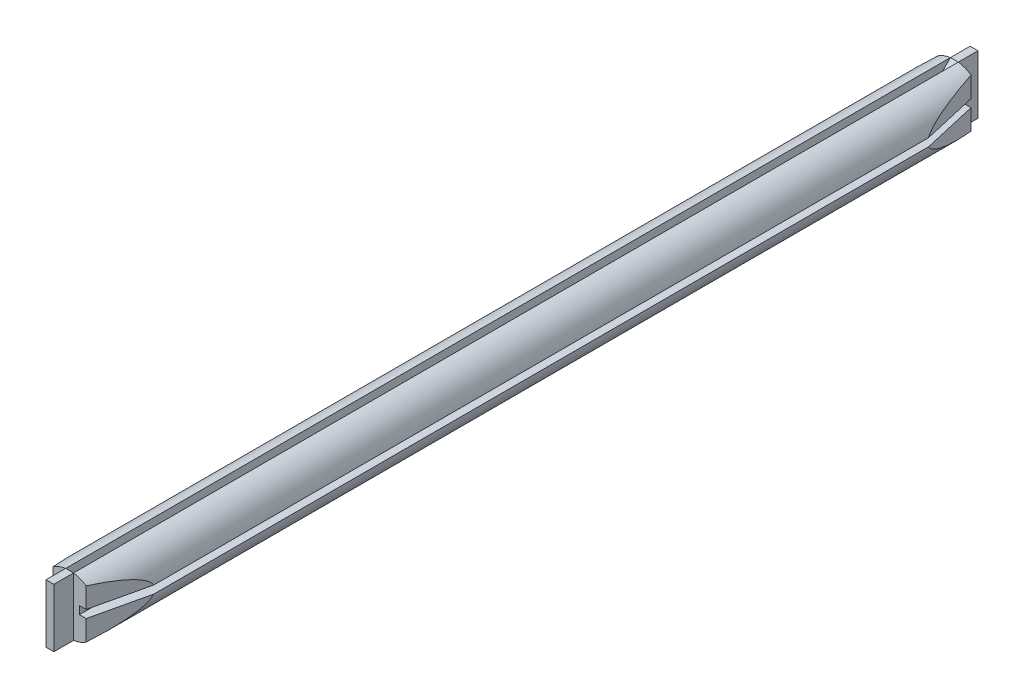
ISO-10303-21;
HEADER;
FILE_DESCRIPTION(('STEP AP214'),'2;1');
FILE_NAME('part.step','',(''),(''),'','','');
FILE_SCHEMA(('AUTOMOTIVE_DESIGN { 1 0 10303 214 1 1 1 1 }'));
ENDSEC;
DATA;
#1=APPLICATION_CONTEXT('core data for automotive mechanical design processes');
#2=APPLICATION_PROTOCOL_DEFINITION('international standard','automotive_design',2000,#1);
#3=PRODUCT_CONTEXT('',#1,'mechanical');
#4=PRODUCT('Part','Part','',(#3));
#5=PRODUCT_RELATED_PRODUCT_CATEGORY('part','',(#4));
#6=PRODUCT_DEFINITION_FORMATION('','',#4);
#7=PRODUCT_DEFINITION_CONTEXT('part definition',#1,'design');
#8=PRODUCT_DEFINITION('design','',#6,#7);
#9=PRODUCT_DEFINITION_SHAPE('','',#8);
#10=(LENGTH_UNIT() NAMED_UNIT(*) SI_UNIT(.MILLI.,.METRE.));
#11=(NAMED_UNIT(*) PLANE_ANGLE_UNIT() SI_UNIT($,.RADIAN.));
#12=(NAMED_UNIT(*) SI_UNIT($,.STERADIAN.) SOLID_ANGLE_UNIT());
#13=UNCERTAINTY_MEASURE_WITH_UNIT(LENGTH_MEASURE(1.E-05),#10,'distance_accuracy_value','');
#14=(GEOMETRIC_REPRESENTATION_CONTEXT(3) GLOBAL_UNCERTAINTY_ASSIGNED_CONTEXT((#13)) GLOBAL_UNIT_ASSIGNED_CONTEXT((#10,
#11,#12)) REPRESENTATION_CONTEXT('',''));
#15=CARTESIAN_POINT('',(0.,0.,0.));
#16=DIRECTION('',(0.,0.,1.));
#17=DIRECTION('',(1.,0.,0.));
#18=AXIS2_PLACEMENT_3D('',#15,#16,#17);
#19=CARTESIAN_POINT('',(0.,0.,2250.));
#20=DIRECTION('',(0.,0.,-1.));
#21=DIRECTION('',(1.,0.,0.));
#22=AXIS2_PLACEMENT_3D('',#19,#20,#21);
#23=PLANE('',#22);
#24=DIRECTION('',(0.,-1.,0.));
#25=VECTOR('',#24,1.);
#26=CARTESIAN_POINT('',(-6.65464811282355,0.,2250.));
#27=LINE('',#26,#25);
#28=CARTESIAN_POINT('',(-6.65464811282354,55.7901455600984,2250.));
#29=VERTEX_POINT('',#28);
#30=CARTESIAN_POINT('',(-6.65464811282356,-92.8705419130867,2250.));
#31=VERTEX_POINT('',#30);
#32=EDGE_CURVE('E238',#29,#31,#27,.T.);
#33=ORIENTED_EDGE('',*,*,#32,.F.);
#34=CARTESIAN_POINT('',(3.34535188717645,-18.5401981764941,2250.));
#35=DIRECTION('',(0.,0.,1.));
#36=DIRECTION('',(1.,0.,0.));
#37=AXIS2_PLACEMENT_3D('',#34,#35,#36);
#38=CIRCLE('',#37,75.);
#39=CARTESIAN_POINT('',(-38.8198199811198,43.4847829304521,2250.));
#40=VERTEX_POINT('',#39);
#41=EDGE_CURVE('E312',#29,#40,#38,.T.);
#42=ORIENTED_EDGE('',*,*,#41,.T.);
#43=DIRECTION('',(0.,1.,0.));
#44=VECTOR('',#43,1.);
#45=CARTESIAN_POINT('',(-38.8198199811198,0.,2250.));
#46=LINE('',#45,#44);
#47=CARTESIAN_POINT('',(-38.8198199811198,-8.54019817649414,2250.));
#48=VERTEX_POINT('',#47);
#49=EDGE_CURVE('E464',#48,#40,#46,.T.);
#50=ORIENTED_EDGE('',*,*,#49,.F.);
#51=DIRECTION('',(1.,0.,0.));
#52=VECTOR('',#51,1.);
#53=CARTESIAN_POINT('',(0.,-8.54019817649415,2250.));
#54=LINE('',#53,#52);
#55=CARTESIAN_POINT('',(-21.6546481128235,-8.54019817649414,2250.));
#56=VERTEX_POINT('',#55);
#57=EDGE_CURVE('E310',#48,#56,#54,.T.);
#58=ORIENTED_EDGE('',*,*,#57,.T.);
#59=DIRECTION('',(0.,1.,0.));
#60=VECTOR('',#59,1.);
#61=CARTESIAN_POINT('',(-21.6546481128235,0.,2250.));
#62=LINE('',#61,#60);
#63=CARTESIAN_POINT('',(-21.6546481128235,-28.5401981764941,2250.));
#64=VERTEX_POINT('',#63);
#65=EDGE_CURVE('E307',#64,#56,#62,.T.);
#66=ORIENTED_EDGE('',*,*,#65,.F.);
#67=DIRECTION('',(1.,0.,0.));
#68=VECTOR('',#67,1.);
#69=CARTESIAN_POINT('',(0.,-28.5401981764941,2250.));
#70=LINE('',#69,#68);
#71=CARTESIAN_POINT('',(-38.8198199811198,-28.5401981764941,2250.));
#72=VERTEX_POINT('',#71);
#73=EDGE_CURVE('E305',#72,#64,#70,.T.);
#74=ORIENTED_EDGE('',*,*,#73,.F.);
#75=CARTESIAN_POINT('',(-38.8198199811198,-80.5651792834404,2250.));
#76=VERTEX_POINT('',#75);
#77=EDGE_CURVE('E465',#76,#72,#46,.T.);
#78=ORIENTED_EDGE('',*,*,#77,.F.);
#79=CARTESIAN_POINT('',(3.34535188717645,-18.5401981764941,2250.));
#80=DIRECTION('',(0.,0.,1.));
#81=DIRECTION('',(1.,0.,0.));
#82=AXIS2_PLACEMENT_3D('',#79,#80,#81);
#83=CIRCLE('',#82,75.);
#84=EDGE_CURVE('E302',#76,#31,#83,.T.);
#85=ORIENTED_EDGE('',*,*,#84,.T.);
#86=EDGE_LOOP('',(#33,#42,#50,#58,#66,#74,#78,#85));
#87=FACE_BOUND('',#86,.T.);
#88=ADVANCED_FACE('F35',(#87),#23,.F.);
#89=CARTESIAN_POINT('',(0.,-8.54019817649414,1125.));
#90=DIRECTION('',(0.,-1.,0.));
#91=DIRECTION('',(0.,0.,-1.));
#92=AXIS2_PLACEMENT_3D('',#89,#90,#91);
#93=PLANE('',#92);
#94=DIRECTION('',(0.,0.,-1.));
#95=VECTOR('',#94,1.);
#96=CARTESIAN_POINT('',(77.675695623769,-8.54019817649414,1125.));
#97=LINE('',#96,#95);
#98=CARTESIAN_POINT('',(77.675695623769,-8.54019817649367,2110.));
#99=VERTEX_POINT('',#98);
#100=CARTESIAN_POINT('',(77.675695623769,-8.54019817649421,140.));
#101=VERTEX_POINT('',#100);
#102=EDGE_CURVE('E454',#99,#101,#97,.T.);
#103=ORIENTED_EDGE('',*,*,#102,.F.);
#104=DIRECTION('',(-0.223917412590911,0.,0.974608122446449));
#105=VECTOR('',#104,1.);
#106=CARTESIAN_POINT('',(288.739366458054,-8.54019817649414,1191.33822390904));
#107=LINE('',#106,#105);
#108=CARTESIAN_POINT('',(45.5105237554727,-8.54019817649414,2250.));
#109=VERTEX_POINT('',#108);
#110=EDGE_CURVE('E289',#99,#109,#107,.T.);
#111=ORIENTED_EDGE('',*,*,#110,.T.);
#112=DIRECTION('',(-1.,0.,0.));
#113=VECTOR('',#112,1.);
#114=CARTESIAN_POINT('',(0.,-8.54019817649414,2250.));
#115=LINE('',#114,#113);
#116=CARTESIAN_POINT('',(28.3453518871764,-8.54019817649414,2250.));
#117=VERTEX_POINT('',#116);
#118=EDGE_CURVE('E292',#109,#117,#115,.T.);
#119=ORIENTED_EDGE('',*,*,#118,.T.);
#120=DIRECTION('',(0.,0.,-1.));
#121=VECTOR('',#120,1.);
#122=CARTESIAN_POINT('',(28.3453518871764,-8.54019817649414,1125.));
#123=LINE('',#122,#121);
#124=CARTESIAN_POINT('',(28.3453518871764,-8.54019817649414,0.));
#125=VERTEX_POINT('',#124);
#126=EDGE_CURVE('E416',#117,#125,#123,.T.);
#127=ORIENTED_EDGE('',*,*,#126,.T.);
#128=DIRECTION('',(-1.,0.,0.));
#129=VECTOR('',#128,1.);
#130=CARTESIAN_POINT('',(0.,-8.54019817649414,0.));
#131=LINE('',#130,#129);
#132=CARTESIAN_POINT('',(45.5105237554727,-8.54019817649414,0.));
#133=VERTEX_POINT('',#132);
#134=EDGE_CURVE('E390',#133,#125,#131,.T.);
#135=ORIENTED_EDGE('',*,*,#134,.F.);
#136=DIRECTION('',(-0.223917412590911,0.,-0.974608122446449));
#137=VECTOR('',#136,1.);
#138=CARTESIAN_POINT('',(288.739366458054,-8.54019817649414,1058.66177609096));
#139=LINE('',#138,#137);
#140=EDGE_CURVE('E388',#101,#133,#139,.T.);
#141=ORIENTED_EDGE('',*,*,#140,.F.);
#142=EDGE_LOOP('',(#103,#111,#119,#127,#135,#141));
#143=FACE_BOUND('',#142,.T.);
#144=ADVANCED_FACE('F37',(#143),#93,.T.);
#145=CARTESIAN_POINT('',(3.34535188717645,-18.5401981764941,1125.));
#146=DIRECTION('',(0.,0.,-1.));
#147=DIRECTION('',(-1.,0.,0.));
#148=AXIS2_PLACEMENT_3D('',#145,#146,#147);
#149=CYLINDRICAL_SURFACE('',#148,75.);
#150=CARTESIAN_POINT('',(3.34535188717645,-18.5401981764941,2433.52533870276));
#151=DIRECTION('',(0.974608122446449,0.,0.223917412590911));
#152=DIRECTION('',(0.223917412590911,0.,-0.974608122446449));
#153=AXIS2_PLACEMENT_3D('',#150,#151,#152);
#154=ELLIPSE('',#153,334.944920683869,75.);
#155=CARTESIAN_POINT('',(45.5105237554727,43.4847829304521,2250.));
#156=VERTEX_POINT('',#155);
#157=EDGE_CURVE('E287',#99,#156,#154,.T.);
#158=ORIENTED_EDGE('',*,*,#157,.F.);
#159=ORIENTED_EDGE('',*,*,#102,.T.);
#160=CARTESIAN_POINT('',(3.34535188717645,-18.5401981764941,-183.525338702757));
#161=DIRECTION('',(-0.974608122446449,0.,0.223917412590911));
#162=DIRECTION('',(-0.223917412590911,0.,-0.974608122446449));
#163=AXIS2_PLACEMENT_3D('',#160,#161,#162);
#164=ELLIPSE('',#163,334.944920683869,75.);
#165=CARTESIAN_POINT('',(45.5105237554727,43.4847829304521,0.));
#166=VERTEX_POINT('',#165);
#167=EDGE_CURVE('E385',#101,#166,#164,.T.);
#168=ORIENTED_EDGE('',*,*,#167,.T.);
#169=CARTESIAN_POINT('',(3.34535188717645,-18.5401981764941,0.));
#170=DIRECTION('',(0.,0.,1.));
#171=DIRECTION('',(1.,0.,0.));
#172=AXIS2_PLACEMENT_3D('',#169,#170,#171);
#173=CIRCLE('',#172,75.);
#174=CARTESIAN_POINT('',(13.3453518871765,55.7901455600984,0.));
#175=VERTEX_POINT('',#174);
#176=EDGE_CURVE('E392',#166,#175,#173,.T.);
#177=ORIENTED_EDGE('',*,*,#176,.T.);
#178=DIRECTION('',(0.,0.,-1.));
#179=VECTOR('',#178,1.);
#180=CARTESIAN_POINT('',(13.3453518871765,55.7901455600984,1125.));
#181=LINE('',#180,#179);
#182=CARTESIAN_POINT('',(13.3453518871764,55.7901455600984,2250.));
#183=VERTEX_POINT('',#182);
#184=EDGE_CURVE('E451',#183,#175,#181,.T.);
#185=ORIENTED_EDGE('',*,*,#184,.F.);
#186=CARTESIAN_POINT('',(3.34535188717645,-18.5401981764941,2250.));
#187=DIRECTION('',(0.,0.,1.));
#188=DIRECTION('',(1.,0.,0.));
#189=AXIS2_PLACEMENT_3D('',#186,#187,#188);
#190=CIRCLE('',#189,75.);
#191=EDGE_CURVE('E315',#156,#183,#190,.T.);
#192=ORIENTED_EDGE('',*,*,#191,.F.);
#193=EDGE_LOOP('',(#158,#159,#168,#177,#185,#192));
#194=FACE_BOUND('',#193,.T.);
#195=ADVANCED_FACE('F525',(#194),#149,.T.);
#196=CARTESIAN_POINT('',(3.34535188717645,-18.5401981764941,1125.));
#197=DIRECTION('',(0.,0.,-1.));
#198=DIRECTION('',(-1.,0.,0.));
#199=AXIS2_PLACEMENT_3D('',#196,#197,#198);
#200=CYLINDRICAL_SURFACE('',#199,75.);
#201=CARTESIAN_POINT('',(3.34535188717645,-18.5401981764941,2433.52533870276));
#202=DIRECTION('',(-0.974608122446449,0.,0.223917412590911));
#203=DIRECTION('',(-0.223917412590911,0.,-0.974608122446449));
#204=AXIS2_PLACEMENT_3D('',#201,#202,#203);
#205=ELLIPSE('',#204,334.944920683869,75.);
#206=CARTESIAN_POINT('',(-70.9849918494161,-8.54019817649414,2110.));
#207=VERTEX_POINT('',#206);
#208=EDGE_CURVE('E281',#40,#207,#205,.T.);
#209=ORIENTED_EDGE('',*,*,#208,.F.);
#210=ORIENTED_EDGE('',*,*,#41,.F.);
#211=DIRECTION('',(0.,0.,-1.));
#212=VECTOR('',#211,1.);
#213=CARTESIAN_POINT('',(-6.65464811282354,55.7901455600984,1125.));
#214=LINE('',#213,#212);
#215=CARTESIAN_POINT('',(-6.65464811282354,55.7901455600984,0.));
#216=VERTEX_POINT('',#215);
#217=EDGE_CURVE('E444',#29,#216,#214,.T.);
#218=ORIENTED_EDGE('',*,*,#217,.T.);
#219=CARTESIAN_POINT('',(3.34535188717645,-18.5401981764941,0.));
#220=DIRECTION('',(0.,0.,1.));
#221=DIRECTION('',(1.,0.,0.));
#222=AXIS2_PLACEMENT_3D('',#219,#220,#221);
#223=CIRCLE('',#222,75.);
#224=CARTESIAN_POINT('',(-38.8198199811198,43.4847829304521,0.));
#225=VERTEX_POINT('',#224);
#226=EDGE_CURVE('E395',#216,#225,#223,.T.);
#227=ORIENTED_EDGE('',*,*,#226,.T.);
#228=CARTESIAN_POINT('',(3.34535188717645,-18.5401981764941,-183.525338702757));
#229=DIRECTION('',(0.974608122446449,0.,0.223917412590911));
#230=DIRECTION('',(0.223917412590911,0.,-0.974608122446449));
#231=AXIS2_PLACEMENT_3D('',#228,#229,#230);
#232=ELLIPSE('',#231,334.944920683869,75.);
#233=CARTESIAN_POINT('',(-70.9849918494161,-8.54019817649414,140.));
#234=VERTEX_POINT('',#233);
#235=EDGE_CURVE('E376',#225,#234,#232,.T.);
#236=ORIENTED_EDGE('',*,*,#235,.T.);
#237=DIRECTION('',(0.,0.,-1.));
#238=VECTOR('',#237,1.);
#239=CARTESIAN_POINT('',(-70.9849918494161,-8.54019817649414,1125.));
#240=LINE('',#239,#238);
#241=EDGE_CURVE('E442',#207,#234,#240,.T.);
#242=ORIENTED_EDGE('',*,*,#241,.F.);
#243=EDGE_LOOP('',(#209,#210,#218,#227,#236,#242));
#244=FACE_BOUND('',#243,.T.);
#245=ADVANCED_FACE('F505',(#244),#200,.T.);
#246=CARTESIAN_POINT('',(0.,-8.54019817649415,1125.));
#247=DIRECTION('',(0.,1.,0.));
#248=DIRECTION('',(-1.,0.,0.));
#249=AXIS2_PLACEMENT_3D('',#246,#247,#248);
#250=PLANE('',#249);
#251=DIRECTION('',(0.223917412590911,0.,0.974608122446449));
#252=VECTOR('',#251,1.);
#253=CARTESIAN_POINT('',(-282.384127931503,-8.54019817649412,1189.87810005568));
#254=LINE('',#253,#252);
#255=EDGE_CURVE('E279',#207,#48,#254,.T.);
#256=ORIENTED_EDGE('',*,*,#255,.F.);
#257=ORIENTED_EDGE('',*,*,#241,.T.);
#258=DIRECTION('',(0.223917412590911,0.,-0.974608122446449));
#259=VECTOR('',#258,1.);
#260=CARTESIAN_POINT('',(-282.384127931503,-8.54019817649412,1060.12189994432));
#261=LINE('',#260,#259);
#262=CARTESIAN_POINT('',(-38.8198199811198,-8.54019817649414,0.));
#263=VERTEX_POINT('',#262);
#264=EDGE_CURVE('E373',#234,#263,#261,.T.);
#265=ORIENTED_EDGE('',*,*,#264,.T.);
#266=DIRECTION('',(1.,0.,0.));
#267=VECTOR('',#266,1.);
#268=CARTESIAN_POINT('',(0.,-8.54019817649415,0.));
#269=LINE('',#268,#267);
#270=CARTESIAN_POINT('',(-21.6546481128235,-8.54019817649414,0.));
#271=VERTEX_POINT('',#270);
#272=EDGE_CURVE('E398',#263,#271,#269,.T.);
#273=ORIENTED_EDGE('',*,*,#272,.T.);
#274=DIRECTION('',(0.,0.,-1.));
#275=VECTOR('',#274,1.);
#276=CARTESIAN_POINT('',(-21.6546481128235,-8.54019817649414,1125.));
#277=LINE('',#276,#275);
#278=EDGE_CURVE('E439',#56,#271,#277,.T.);
#279=ORIENTED_EDGE('',*,*,#278,.F.);
#280=ORIENTED_EDGE('',*,*,#57,.F.);
#281=EDGE_LOOP('',(#256,#257,#265,#273,#279,#280));
#282=FACE_BOUND('',#281,.T.);
#283=ADVANCED_FACE('F605',(#282),#250,.F.);
#284=CARTESIAN_POINT('',(0.,-28.5401981764941,1125.));
#285=DIRECTION('',(0.,1.,0.));
#286=DIRECTION('',(-1.,0.,0.));
#287=AXIS2_PLACEMENT_3D('',#284,#285,#286);
#288=PLANE('',#287);
#289=DIRECTION('',(0.,0.,-1.));
#290=VECTOR('',#289,1.);
#291=CARTESIAN_POINT('',(-70.9849918494161,-28.5401981764941,1125.));
#292=LINE('',#291,#290);
#293=CARTESIAN_POINT('',(-70.9849918494161,-28.5401981764947,2110.));
#294=VERTEX_POINT('',#293);
#295=CARTESIAN_POINT('',(-70.9849918494161,-28.5401981764941,140.));
#296=VERTEX_POINT('',#295);
#297=EDGE_CURVE('E434',#294,#296,#292,.T.);
#298=ORIENTED_EDGE('',*,*,#297,.F.);
#299=DIRECTION('',(0.223917412590911,0.,0.974608122446449));
#300=VECTOR('',#299,1.);
#301=CARTESIAN_POINT('',(-282.384127931503,-28.5401981764942,1189.87810005568));
#302=LINE('',#301,#300);
#303=EDGE_CURVE('E276',#294,#72,#302,.T.);
#304=ORIENTED_EDGE('',*,*,#303,.T.);
#305=ORIENTED_EDGE('',*,*,#73,.T.);
#306=DIRECTION('',(0.,0.,-1.));
#307=VECTOR('',#306,1.);
#308=CARTESIAN_POINT('',(-21.6546481128235,-28.5401981764941,1125.));
#309=LINE('',#308,#307);
#310=CARTESIAN_POINT('',(-21.6546481128235,-28.5401981764941,0.));
#311=VERTEX_POINT('',#310);
#312=EDGE_CURVE('E436',#64,#311,#309,.T.);
#313=ORIENTED_EDGE('',*,*,#312,.T.);
#314=DIRECTION('',(1.,0.,0.));
#315=VECTOR('',#314,1.);
#316=CARTESIAN_POINT('',(0.,-28.5401981764941,0.));
#317=LINE('',#316,#315);
#318=CARTESIAN_POINT('',(-38.8198199811198,-28.5401981764941,0.));
#319=VERTEX_POINT('',#318);
#320=EDGE_CURVE('E403',#319,#311,#317,.T.);
#321=ORIENTED_EDGE('',*,*,#320,.F.);
#322=DIRECTION('',(0.223917412590911,0.,-0.974608122446449));
#323=VECTOR('',#322,1.);
#324=CARTESIAN_POINT('',(-282.384127931503,-28.5401981764942,1060.12189994432));
#325=LINE('',#324,#323);
#326=EDGE_CURVE('E371',#296,#319,#325,.T.);
#327=ORIENTED_EDGE('',*,*,#326,.F.);
#328=EDGE_LOOP('',(#298,#304,#305,#313,#321,#327));
#329=FACE_BOUND('',#328,.T.);
#330=ADVANCED_FACE('F479',(#329),#288,.T.);
#331=CARTESIAN_POINT('',(3.34535188717645,-18.5401981764941,1125.));
#332=DIRECTION('',(0.,0.,-1.));
#333=DIRECTION('',(-1.,0.,0.));
#334=AXIS2_PLACEMENT_3D('',#331,#332,#333);
#335=CYLINDRICAL_SURFACE('',#334,75.);
#336=CARTESIAN_POINT('',(3.34535188717645,-18.5401981764941,2433.52533870276));
#337=DIRECTION('',(-0.974608122446449,0.,0.223917412590911));
#338=DIRECTION('',(-0.223917412590911,0.,-0.974608122446449));
#339=AXIS2_PLACEMENT_3D('',#336,#337,#338);
#340=ELLIPSE('',#339,334.944920683869,75.);
#341=EDGE_CURVE('E274',#294,#76,#340,.T.);
#342=ORIENTED_EDGE('',*,*,#341,.F.);
#343=ORIENTED_EDGE('',*,*,#297,.T.);
#344=CARTESIAN_POINT('',(3.34535188717645,-18.5401981764941,-183.525338702757));
#345=DIRECTION('',(0.974608122446449,0.,0.223917412590911));
#346=DIRECTION('',(0.223917412590911,0.,-0.974608122446449));
#347=AXIS2_PLACEMENT_3D('',#344,#345,#346);
#348=ELLIPSE('',#347,334.944920683869,75.);
#349=CARTESIAN_POINT('',(-38.8198199811198,-80.5651792834404,0.));
#350=VERTEX_POINT('',#349);
#351=EDGE_CURVE('E368',#296,#350,#348,.T.);
#352=ORIENTED_EDGE('',*,*,#351,.T.);
#353=CARTESIAN_POINT('',(3.34535188717645,-18.5401981764941,0.));
#354=DIRECTION('',(0.,0.,1.));
#355=DIRECTION('',(1.,0.,0.));
#356=AXIS2_PLACEMENT_3D('',#353,#354,#355);
#357=CIRCLE('',#356,75.);
#358=CARTESIAN_POINT('',(-6.65464811282357,-92.8705419130867,0.));
#359=VERTEX_POINT('',#358);
#360=EDGE_CURVE('E405',#350,#359,#357,.T.);
#361=ORIENTED_EDGE('',*,*,#360,.T.);
#362=DIRECTION('',(0.,0.,-1.));
#363=VECTOR('',#362,1.);
#364=CARTESIAN_POINT('',(-6.65464811282355,-92.8705419130867,1125.));
#365=LINE('',#364,#363);
#366=EDGE_CURVE('E431',#31,#359,#365,.T.);
#367=ORIENTED_EDGE('',*,*,#366,.F.);
#368=ORIENTED_EDGE('',*,*,#84,.F.);
#369=EDGE_LOOP('',(#342,#343,#352,#361,#367,#368));
#370=FACE_BOUND('',#369,.T.);
#371=ADVANCED_FACE('F500',(#370),#335,.T.);
#372=CARTESIAN_POINT('',(3.34535188717645,-18.5401981764941,1125.));
#373=DIRECTION('',(0.,0.,-1.));
#374=DIRECTION('',(-1.,0.,0.));
#375=AXIS2_PLACEMENT_3D('',#372,#373,#374);
#376=CYLINDRICAL_SURFACE('',#375,75.);
#377=CARTESIAN_POINT('',(3.34535188717645,-18.5401981764941,2433.52533870276));
#378=DIRECTION('',(0.974608122446449,0.,0.223917412590911));
#379=DIRECTION('',(0.223917412590911,0.,-0.974608122446449));
#380=AXIS2_PLACEMENT_3D('',#377,#378,#379);
#381=ELLIPSE('',#380,334.944920683869,75.);
#382=CARTESIAN_POINT('',(45.5105237554727,-80.5651792834404,2250.));
#383=VERTEX_POINT('',#382);
#384=CARTESIAN_POINT('',(77.675695623769,-28.5401981764941,2110.));
#385=VERTEX_POINT('',#384);
#386=EDGE_CURVE('E285',#383,#385,#381,.T.);
#387=ORIENTED_EDGE('',*,*,#386,.F.);
#388=CARTESIAN_POINT('',(3.34535188717645,-18.5401981764941,2250.));
#389=DIRECTION('',(0.,0.,1.));
#390=DIRECTION('',(1.,0.,0.));
#391=AXIS2_PLACEMENT_3D('',#388,#389,#390);
#392=CIRCLE('',#391,75.);
#393=CARTESIAN_POINT('',(13.3453518871765,-92.8705419130867,2250.));
#394=VERTEX_POINT('',#393);
#395=EDGE_CURVE('E299',#394,#383,#392,.T.);
#396=ORIENTED_EDGE('',*,*,#395,.F.);
#397=DIRECTION('',(0.,0.,-1.));
#398=VECTOR('',#397,1.);
#399=CARTESIAN_POINT('',(13.3453518871765,-92.8705419130867,1125.));
#400=LINE('',#399,#398);
#401=CARTESIAN_POINT('',(13.3453518871764,-92.8705419130867,0.));
#402=VERTEX_POINT('',#401);
#403=EDGE_CURVE('E424',#394,#402,#400,.T.);
#404=ORIENTED_EDGE('',*,*,#403,.T.);
#405=CARTESIAN_POINT('',(3.34535188717645,-18.5401981764941,0.));
#406=DIRECTION('',(0.,0.,1.));
#407=DIRECTION('',(1.,0.,0.));
#408=AXIS2_PLACEMENT_3D('',#405,#406,#407);
#409=CIRCLE('',#408,75.);
#410=CARTESIAN_POINT('',(45.5105237554727,-80.5651792834404,0.));
#411=VERTEX_POINT('',#410);
#412=EDGE_CURVE('E408',#402,#411,#409,.T.);
#413=ORIENTED_EDGE('',*,*,#412,.T.);
#414=CARTESIAN_POINT('',(3.34535188717645,-18.5401981764941,-183.525338702757));
#415=DIRECTION('',(-0.974608122446449,0.,0.223917412590911));
#416=DIRECTION('',(-0.223917412590911,0.,-0.974608122446449));
#417=AXIS2_PLACEMENT_3D('',#414,#415,#416);
#418=ELLIPSE('',#417,334.944920683869,75.);
#419=CARTESIAN_POINT('',(77.675695623769,-28.5401981764941,140.));
#420=VERTEX_POINT('',#419);
#421=EDGE_CURVE('E382',#411,#420,#418,.T.);
#422=ORIENTED_EDGE('',*,*,#421,.T.);
#423=DIRECTION('',(0.,0.,-1.));
#424=VECTOR('',#423,1.);
#425=CARTESIAN_POINT('',(77.675695623769,-28.5401981764941,1125.));
#426=LINE('',#425,#424);
#427=EDGE_CURVE('E422',#385,#420,#426,.T.);
#428=ORIENTED_EDGE('',*,*,#427,.F.);
#429=EDGE_LOOP('',(#387,#396,#404,#413,#422,#428));
#430=FACE_BOUND('',#429,.T.);
#431=ADVANCED_FACE('F578',(#430),#376,.T.);
#432=CARTESIAN_POINT('',(0.,-28.5401981764941,1125.));
#433=DIRECTION('',(0.,-1.,0.));
#434=DIRECTION('',(1.,0.,0.));
#435=AXIS2_PLACEMENT_3D('',#432,#433,#434);
#436=PLANE('',#435);
#437=DIRECTION('',(-0.223917412590911,0.,0.974608122446449));
#438=VECTOR('',#437,1.);
#439=CARTESIAN_POINT('',(288.739366458054,-28.5401981764942,1191.33822390904));
#440=LINE('',#439,#438);
#441=CARTESIAN_POINT('',(45.5105237554727,-28.5401981764941,2250.));
#442=VERTEX_POINT('',#441);
#443=EDGE_CURVE('E283',#385,#442,#440,.T.);
#444=ORIENTED_EDGE('',*,*,#443,.F.);
#445=ORIENTED_EDGE('',*,*,#427,.T.);
#446=DIRECTION('',(-0.223917412590911,0.,-0.974608122446449));
#447=VECTOR('',#446,1.);
#448=CARTESIAN_POINT('',(288.739366458054,-28.5401981764942,1058.66177609096));
#449=LINE('',#448,#447);
#450=CARTESIAN_POINT('',(45.5105237554727,-28.5401981764941,0.));
#451=VERTEX_POINT('',#450);
#452=EDGE_CURVE('E379',#420,#451,#449,.T.);
#453=ORIENTED_EDGE('',*,*,#452,.T.);
#454=DIRECTION('',(-1.,0.,0.));
#455=VECTOR('',#454,1.);
#456=CARTESIAN_POINT('',(0.,-28.5401981764941,0.));
#457=LINE('',#456,#455);
#458=CARTESIAN_POINT('',(28.3453518871764,-28.5401981764941,0.));
#459=VERTEX_POINT('',#458);
#460=EDGE_CURVE('E411',#451,#459,#457,.T.);
#461=ORIENTED_EDGE('',*,*,#460,.T.);
#462=DIRECTION('',(0.,0.,-1.));
#463=VECTOR('',#462,1.);
#464=CARTESIAN_POINT('',(28.3453518871764,-28.5401981764941,1125.));
#465=LINE('',#464,#463);
#466=CARTESIAN_POINT('',(28.3453518871764,-28.5401981764941,2250.));
#467=VERTEX_POINT('',#466);
#468=EDGE_CURVE('E419',#467,#459,#465,.T.);
#469=ORIENTED_EDGE('',*,*,#468,.F.);
#470=DIRECTION('',(-1.,0.,0.));
#471=VECTOR('',#470,1.);
#472=CARTESIAN_POINT('',(0.,-28.5401981764941,2250.));
#473=LINE('',#472,#471);
#474=EDGE_CURVE('E297',#442,#467,#473,.T.);
#475=ORIENTED_EDGE('',*,*,#474,.F.);
#476=EDGE_LOOP('',(#444,#445,#453,#461,#469,#475));
#477=FACE_BOUND('',#476,.T.);
#478=ADVANCED_FACE('F572',(#477),#436,.F.);
#479=ORIENTED_EDGE('',*,*,#191,.T.);
#480=DIRECTION('',(0.,-1.,0.));
#481=VECTOR('',#480,1.);
#482=CARTESIAN_POINT('',(13.3453518871765,0.,2250.));
#483=LINE('',#482,#481);
#484=EDGE_CURVE('E232',#183,#394,#483,.T.);
#485=ORIENTED_EDGE('',*,*,#484,.T.);
#486=ORIENTED_EDGE('',*,*,#395,.T.);
#487=DIRECTION('',(0.,-1.,0.));
#488=VECTOR('',#487,1.);
#489=CARTESIAN_POINT('',(45.5105237554727,0.,2250.));
#490=LINE('',#489,#488);
#491=EDGE_CURVE('E466',#442,#383,#490,.T.);
#492=ORIENTED_EDGE('',*,*,#491,.F.);
#493=ORIENTED_EDGE('',*,*,#474,.T.);
#494=DIRECTION('',(0.,-1.,0.));
#495=VECTOR('',#494,1.);
#496=CARTESIAN_POINT('',(28.3453518871764,0.,2250.));
#497=LINE('',#496,#495);
#498=EDGE_CURVE('E294',#117,#467,#497,.T.);
#499=ORIENTED_EDGE('',*,*,#498,.F.);
#500=ORIENTED_EDGE('',*,*,#118,.F.);
#501=EDGE_CURVE('E43',#156,#109,#490,.T.);
#502=ORIENTED_EDGE('',*,*,#501,.F.);
#503=EDGE_LOOP('',(#479,#485,#486,#492,#493,#499,#500,#502));
#504=FACE_BOUND('',#503,.T.);
#505=ADVANCED_FACE('F519',(#504),#23,.F.);
#506=CARTESIAN_POINT('',(0.,0.,0.));
#507=DIRECTION('',(0.,0.,1.));
#508=DIRECTION('',(1.,0.,0.));
#509=AXIS2_PLACEMENT_3D('',#506,#507,#508);
#510=PLANE('',#509);
#511=DIRECTION('',(0.,-1.,0.));
#512=VECTOR('',#511,1.);
#513=CARTESIAN_POINT('',(13.3453518871765,0.,0.));
#514=LINE('',#513,#512);
#515=EDGE_CURVE('E323',#175,#402,#514,.T.);
#516=ORIENTED_EDGE('',*,*,#515,.F.);
#517=ORIENTED_EDGE('',*,*,#176,.F.);
#518=DIRECTION('',(0.,-1.,0.));
#519=VECTOR('',#518,1.);
#520=CARTESIAN_POINT('',(45.5105237554727,0.,0.));
#521=LINE('',#520,#519);
#522=EDGE_CURVE('E463',#166,#133,#521,.T.);
#523=ORIENTED_EDGE('',*,*,#522,.T.);
#524=ORIENTED_EDGE('',*,*,#134,.T.);
#525=DIRECTION('',(0.,-1.,0.));
#526=VECTOR('',#525,1.);
#527=CARTESIAN_POINT('',(28.3453518871764,0.,0.));
#528=LINE('',#527,#526);
#529=EDGE_CURVE('E413',#125,#459,#528,.T.);
#530=ORIENTED_EDGE('',*,*,#529,.T.);
#531=ORIENTED_EDGE('',*,*,#460,.F.);
#532=EDGE_CURVE('E460',#451,#411,#521,.T.);
#533=ORIENTED_EDGE('',*,*,#532,.T.);
#534=ORIENTED_EDGE('',*,*,#412,.F.);
#535=EDGE_LOOP('',(#516,#517,#523,#524,#530,#531,#533,#534));
#536=FACE_BOUND('',#535,.T.);
#537=ADVANCED_FACE('F530',(#536),#510,.F.);
#538=CARTESIAN_POINT('',(13.3453518871765,0.,1125.));
#539=DIRECTION('',(1.,0.,0.));
#540=DIRECTION('',(0.,1.,0.));
#541=AXIS2_PLACEMENT_3D('',#538,#539,#540);
#542=PLANE('',#541);
#543=DIRECTION('',(0.,0.,-1.));
#544=VECTOR('',#543,1.);
#545=CARTESIAN_POINT('',(13.3453518871765,6.45980182350586,1125.));
#546=LINE('',#545,#544);
#547=CARTESIAN_POINT('',(13.3453518871765,6.45980182350586,2200.66965626341));
#548=VERTEX_POINT('',#547);
#549=CARTESIAN_POINT('',(13.3453518871765,6.45980182350586,49.3303437365926));
#550=VERTEX_POINT('',#549);
#551=EDGE_CURVE('E449',#548,#550,#546,.T.);
#552=ORIENTED_EDGE('',*,*,#551,.F.);
#553=DIRECTION('',(0.,-0.707106781186548,-0.707106781186548));
#554=VECTOR('',#553,1.);
#555=CARTESIAN_POINT('',(13.3453518871764,-18.5401981764941,2175.66965626341));
#556=LINE('',#555,#554);
#557=EDGE_CURVE('E262',#183,#548,#556,.T.);
#558=ORIENTED_EDGE('',*,*,#557,.F.);
#559=ORIENTED_EDGE('',*,*,#184,.T.);
#560=DIRECTION('',(0.,-0.707106781186547,0.707106781186548));
#561=VECTOR('',#560,1.);
#562=CARTESIAN_POINT('',(13.3453518871764,-18.5401981764941,74.3303437365925));
#563=LINE('',#562,#561);
#564=EDGE_CURVE('E356',#175,#550,#563,.T.);
#565=ORIENTED_EDGE('',*,*,#564,.T.);
#566=EDGE_LOOP('',(#552,#558,#559,#565));
#567=FACE_BOUND('',#566,.T.);
#568=ADVANCED_FACE('F513',(#567),#542,.F.);
#569=CARTESIAN_POINT('',(0.,6.45980182350586,1125.));
#570=DIRECTION('',(0.,1.,0.));
#571=DIRECTION('',(0.,0.,1.));
#572=AXIS2_PLACEMENT_3D('',#569,#570,#571);
#573=PLANE('',#572);
#574=DIRECTION('',(-1.,0.,0.));
#575=VECTOR('',#574,1.);
#576=CARTESIAN_POINT('',(-2.26958411043693E-13,6.45980182350586,2200.66965626341));
#577=LINE('',#576,#575);
#578=CARTESIAN_POINT('',(-6.65464811282355,6.45980182350589,2200.66965626341));
#579=VERTEX_POINT('',#578);
#580=EDGE_CURVE('E50',#548,#579,#577,.T.);
#581=ORIENTED_EDGE('',*,*,#580,.F.);
#582=ORIENTED_EDGE('',*,*,#551,.T.);
#583=DIRECTION('',(-1.,0.,0.));
#584=VECTOR('',#583,1.);
#585=CARTESIAN_POINT('',(-2.26958411043693E-13,6.45980182350586,49.3303437365926));
#586=LINE('',#585,#584);
#587=CARTESIAN_POINT('',(-6.65464811282355,6.45980182350583,49.3303437365926));
#588=VERTEX_POINT('',#587);
#589=EDGE_CURVE('E365',#550,#588,#586,.T.);
#590=ORIENTED_EDGE('',*,*,#589,.T.);
#591=DIRECTION('',(0.,0.,-1.));
#592=VECTOR('',#591,1.);
#593=CARTESIAN_POINT('',(-6.65464811282355,6.45980182350586,1125.));
#594=LINE('',#593,#592);
#595=EDGE_CURVE('E447',#579,#588,#594,.T.);
#596=ORIENTED_EDGE('',*,*,#595,.F.);
#597=EDGE_LOOP('',(#581,#582,#590,#596));
#598=FACE_BOUND('',#597,.T.);
#599=ADVANCED_FACE('F553',(#598),#573,.T.);
#600=CARTESIAN_POINT('',(-6.65464811282355,0.,1125.));
#601=DIRECTION('',(1.,0.,0.));
#602=DIRECTION('',(0.,1.,0.));
#603=AXIS2_PLACEMENT_3D('',#600,#601,#602);
#604=PLANE('',#603);
#605=DIRECTION('',(0.,-0.707106781186548,-0.707106781186548));
#606=VECTOR('',#605,1.);
#607=CARTESIAN_POINT('',(-6.65464811282355,-18.5401981764941,2175.66965626341));
#608=LINE('',#607,#606);
#609=EDGE_CURVE('E58',#29,#579,#608,.T.);
#610=ORIENTED_EDGE('',*,*,#609,.T.);
#611=ORIENTED_EDGE('',*,*,#595,.T.);
#612=DIRECTION('',(0.,-0.707106781186548,0.707106781186548));
#613=VECTOR('',#612,1.);
#614=CARTESIAN_POINT('',(-6.65464811282355,-18.5401981764941,74.3303437365925));
#615=LINE('',#614,#613);
#616=EDGE_CURVE('E349',#216,#588,#615,.T.);
#617=ORIENTED_EDGE('',*,*,#616,.F.);
#618=ORIENTED_EDGE('',*,*,#217,.F.);
#619=EDGE_LOOP('',(#610,#611,#617,#618));
#620=FACE_BOUND('',#619,.T.);
#621=ADVANCED_FACE('F507',(#620),#604,.T.);
#622=CARTESIAN_POINT('',(-6.65464811282353,0.,1125.));
#623=DIRECTION('',(-1.,0.,0.));
#624=DIRECTION('',(0.,-1.,0.));
#625=AXIS2_PLACEMENT_3D('',#622,#623,#624);
#626=PLANE('',#625);
#627=DIRECTION('',(0.,0.,-1.));
#628=VECTOR('',#627,1.);
#629=CARTESIAN_POINT('',(-6.65464811282354,-43.5401981764941,1125.));
#630=LINE('',#629,#628);
#631=CARTESIAN_POINT('',(-6.65464811282354,-43.5401981764941,2200.66965626341));
#632=VERTEX_POINT('',#631);
#633=CARTESIAN_POINT('',(-6.65464811282356,-43.5401981764941,49.3303437365926));
#634=VERTEX_POINT('',#633);
#635=EDGE_CURVE('E429',#632,#634,#630,.T.);
#636=ORIENTED_EDGE('',*,*,#635,.F.);
#637=DIRECTION('',(0.,-0.707106781186548,0.707106781186548));
#638=VECTOR('',#637,1.);
#639=CARTESIAN_POINT('',(-6.65464811282357,-92.8705419130867,2250.));
#640=LINE('',#639,#638);
#641=EDGE_CURVE('E258',#632,#31,#640,.T.);
#642=ORIENTED_EDGE('',*,*,#641,.T.);
#643=ORIENTED_EDGE('',*,*,#366,.T.);
#644=DIRECTION('',(0.,-0.707106781186548,-0.707106781186548));
#645=VECTOR('',#644,1.);
#646=CARTESIAN_POINT('',(-6.65464811282357,-92.8705419130867,0.));
#647=LINE('',#646,#645);
#648=EDGE_CURVE('E345',#634,#359,#647,.T.);
#649=ORIENTED_EDGE('',*,*,#648,.F.);
#650=EDGE_LOOP('',(#636,#642,#643,#649));
#651=FACE_BOUND('',#650,.T.);
#652=ADVANCED_FACE('F560',(#651),#626,.F.);
#653=CARTESIAN_POINT('',(0.,-43.5401981764941,1125.));
#654=DIRECTION('',(0.,-1.,0.));
#655=DIRECTION('',(0.,0.,-1.));
#656=AXIS2_PLACEMENT_3D('',#653,#654,#655);
#657=PLANE('',#656);
#658=DIRECTION('',(1.,0.,0.));
#659=VECTOR('',#658,1.);
#660=CARTESIAN_POINT('',(2.26958411043693E-13,-43.5401981764941,2200.66965626341));
#661=LINE('',#660,#659);
#662=CARTESIAN_POINT('',(13.3453518871765,-43.5401981764941,2200.66965626341));
#663=VERTEX_POINT('',#662);
#664=EDGE_CURVE('E265',#632,#663,#661,.T.);
#665=ORIENTED_EDGE('',*,*,#664,.F.);
#666=ORIENTED_EDGE('',*,*,#635,.T.);
#667=DIRECTION('',(1.,0.,0.));
#668=VECTOR('',#667,1.);
#669=CARTESIAN_POINT('',(2.26958411043693E-13,-43.5401981764941,49.3303437365924));
#670=LINE('',#669,#668);
#671=CARTESIAN_POINT('',(13.3453518871764,-43.5401981764941,49.3303437365926));
#672=VERTEX_POINT('',#671);
#673=EDGE_CURVE('E355',#634,#672,#670,.T.);
#674=ORIENTED_EDGE('',*,*,#673,.T.);
#675=DIRECTION('',(0.,0.,-1.));
#676=VECTOR('',#675,1.);
#677=CARTESIAN_POINT('',(13.3453518871765,-43.5401981764941,1125.));
#678=LINE('',#677,#676);
#679=EDGE_CURVE('E427',#663,#672,#678,.T.);
#680=ORIENTED_EDGE('',*,*,#679,.F.);
#681=EDGE_LOOP('',(#665,#666,#674,#680));
#682=FACE_BOUND('',#681,.T.);
#683=ADVANCED_FACE('F593',(#682),#657,.T.);
#684=CARTESIAN_POINT('',(13.3453518871765,0.,1125.));
#685=DIRECTION('',(-1.,0.,0.));
#686=DIRECTION('',(0.,-1.,0.));
#687=AXIS2_PLACEMENT_3D('',#684,#685,#686);
#688=PLANE('',#687);
#689=DIRECTION('',(0.,-0.707106781186548,0.707106781186548));
#690=VECTOR('',#689,1.);
#691=CARTESIAN_POINT('',(13.3453518871765,516.064729043457,1641.06472904346));
#692=LINE('',#691,#690);
#693=EDGE_CURVE('E11',#663,#394,#692,.T.);
#694=ORIENTED_EDGE('',*,*,#693,.F.);
#695=ORIENTED_EDGE('',*,*,#679,.T.);
#696=DIRECTION('',(0.,-0.707106781186547,-0.707106781186548));
#697=VECTOR('',#696,1.);
#698=CARTESIAN_POINT('',(13.3453518871764,-92.8705419130867,0.));
#699=LINE('',#698,#697);
#700=EDGE_CURVE('E352',#672,#402,#699,.T.);
#701=ORIENTED_EDGE('',*,*,#700,.T.);
#702=ORIENTED_EDGE('',*,*,#403,.F.);
#703=EDGE_LOOP('',(#694,#695,#701,#702));
#704=FACE_BOUND('',#703,.T.);
#705=ADVANCED_FACE('F590',(#704),#688,.T.);
#706=CARTESIAN_POINT('',(-21.6546481128235,0.,1125.));
#707=DIRECTION('',(-1.,0.,0.));
#708=DIRECTION('',(0.,-1.,0.));
#709=AXIS2_PLACEMENT_3D('',#706,#707,#708);
#710=PLANE('',#709);
#711=DIRECTION('',(0.,1.,0.));
#712=VECTOR('',#711,1.);
#713=CARTESIAN_POINT('',(-21.6546481128235,0.,0.));
#714=LINE('',#713,#712);
#715=EDGE_CURVE('E400',#311,#271,#714,.T.);
#716=ORIENTED_EDGE('',*,*,#715,.F.);
#717=ORIENTED_EDGE('',*,*,#312,.F.);
#718=ORIENTED_EDGE('',*,*,#65,.T.);
#719=ORIENTED_EDGE('',*,*,#278,.T.);
#720=EDGE_LOOP('',(#716,#717,#718,#719));
#721=FACE_BOUND('',#720,.T.);
#722=ADVANCED_FACE('F488',(#721),#710,.T.);
#723=CARTESIAN_POINT('',(28.3453518871764,0.,1125.));
#724=DIRECTION('',(1.,0.,0.));
#725=DIRECTION('',(0.,0.,-1.));
#726=AXIS2_PLACEMENT_3D('',#723,#724,#725);
#727=PLANE('',#726);
#728=ORIENTED_EDGE('',*,*,#529,.F.);
#729=ORIENTED_EDGE('',*,*,#126,.F.);
#730=ORIENTED_EDGE('',*,*,#498,.T.);
#731=ORIENTED_EDGE('',*,*,#468,.T.);
#732=EDGE_LOOP('',(#728,#729,#730,#731));
#733=FACE_BOUND('',#732,.T.);
#734=ADVANCED_FACE('F588',(#733),#727,.T.);
#735=ORIENTED_EDGE('',*,*,#226,.F.);
#736=DIRECTION('',(0.,-1.,0.));
#737=VECTOR('',#736,1.);
#738=CARTESIAN_POINT('',(-6.65464811282355,0.,0.));
#739=LINE('',#738,#737);
#740=EDGE_CURVE('E318',#216,#359,#739,.T.);
#741=ORIENTED_EDGE('',*,*,#740,.T.);
#742=ORIENTED_EDGE('',*,*,#360,.F.);
#743=DIRECTION('',(0.,1.,0.));
#744=VECTOR('',#743,1.);
#745=CARTESIAN_POINT('',(-38.8198199811198,0.,0.));
#746=LINE('',#745,#744);
#747=EDGE_CURVE('E459',#350,#319,#746,.T.);
#748=ORIENTED_EDGE('',*,*,#747,.T.);
#749=ORIENTED_EDGE('',*,*,#320,.T.);
#750=ORIENTED_EDGE('',*,*,#715,.T.);
#751=ORIENTED_EDGE('',*,*,#272,.F.);
#752=EDGE_CURVE('E456',#263,#225,#746,.T.);
#753=ORIENTED_EDGE('',*,*,#752,.T.);
#754=EDGE_LOOP('',(#735,#741,#742,#748,#749,#750,#751,#753));
#755=FACE_BOUND('',#754,.T.);
#756=ADVANCED_FACE('F493',(#755),#510,.F.);
#757=CARTESIAN_POINT('',(-70.9849918494161,-110.,140.));
#758=DIRECTION('',(0.974608122446449,0.,0.223917412590911));
#759=DIRECTION('',(0.223917412590911,0.,-0.974608122446449));
#760=AXIS2_PLACEMENT_3D('',#757,#758,#759);
#761=PLANE('',#760);
#762=ORIENTED_EDGE('',*,*,#752,.F.);
#763=ORIENTED_EDGE('',*,*,#264,.F.);
#764=ORIENTED_EDGE('',*,*,#235,.F.);
#765=EDGE_LOOP('',(#762,#763,#764));
#766=FACE_BOUND('',#765,.T.);
#767=ADVANCED_FACE('F707',(#766),#761,.F.);
#768=ORIENTED_EDGE('',*,*,#326,.T.);
#769=ORIENTED_EDGE('',*,*,#747,.F.);
#770=ORIENTED_EDGE('',*,*,#351,.F.);
#771=EDGE_LOOP('',(#768,#769,#770));
#772=FACE_BOUND('',#771,.T.);
#773=ADVANCED_FACE('F498',(#772),#761,.F.);
#774=CARTESIAN_POINT('',(77.675695623769,-110.,140.));
#775=DIRECTION('',(-0.974608122446449,0.,0.223917412590911));
#776=DIRECTION('',(0.223917412590911,0.,0.974608122446449));
#777=AXIS2_PLACEMENT_3D('',#774,#775,#776);
#778=PLANE('',#777);
#779=ORIENTED_EDGE('',*,*,#532,.F.);
#780=ORIENTED_EDGE('',*,*,#452,.F.);
#781=ORIENTED_EDGE('',*,*,#421,.F.);
#782=EDGE_LOOP('',(#779,#780,#781));
#783=FACE_BOUND('',#782,.T.);
#784=ADVANCED_FACE('F723',(#783),#778,.F.);
#785=ORIENTED_EDGE('',*,*,#140,.T.);
#786=ORIENTED_EDGE('',*,*,#522,.F.);
#787=ORIENTED_EDGE('',*,*,#167,.F.);
#788=EDGE_LOOP('',(#785,#786,#787));
#789=FACE_BOUND('',#788,.T.);
#790=ADVANCED_FACE('F697',(#789),#778,.F.);
#791=CARTESIAN_POINT('',(179.553053273123,-18.5401981764942,74.3303437365925));
#792=DIRECTION('',(0.,-0.707106781186548,-0.707106781186547));
#793=DIRECTION('',(0.,0.707106781186547,-0.707106781186548));
#794=AXIS2_PLACEMENT_3D('',#791,#792,#793);
#795=PLANE('',#794);
#796=ORIENTED_EDGE('',*,*,#589,.F.);
#797=ORIENTED_EDGE('',*,*,#564,.F.);
#798=DIRECTION('',(-1.,0.,0.));
#799=VECTOR('',#798,1.);
#800=CARTESIAN_POINT('',(179.553053273123,55.7901455600984,0.));
#801=LINE('',#800,#799);
#802=EDGE_CURVE('E344',#175,#216,#801,.T.);
#803=ORIENTED_EDGE('',*,*,#802,.T.);
#804=ORIENTED_EDGE('',*,*,#616,.T.);
#805=EDGE_LOOP('',(#796,#797,#803,#804));
#806=FACE_BOUND('',#805,.T.);
#807=ADVANCED_FACE('F552',(#806),#795,.F.);
#808=CARTESIAN_POINT('',(179.553053273123,-92.8705419130867,0.));
#809=DIRECTION('',(0.,0.707106781186548,-0.707106781186547));
#810=DIRECTION('',(0.,0.707106781186547,0.707106781186548));
#811=AXIS2_PLACEMENT_3D('',#808,#809,#810);
#812=PLANE('',#811);
#813=ORIENTED_EDGE('',*,*,#673,.F.);
#814=ORIENTED_EDGE('',*,*,#648,.T.);
#815=DIRECTION('',(-1.,0.,0.));
#816=VECTOR('',#815,1.);
#817=CARTESIAN_POINT('',(179.553053273123,-92.8705419130867,0.));
#818=LINE('',#817,#816);
#819=EDGE_CURVE('E348',#402,#359,#818,.T.);
#820=ORIENTED_EDGE('',*,*,#819,.F.);
#821=ORIENTED_EDGE('',*,*,#700,.F.);
#822=EDGE_LOOP('',(#813,#814,#820,#821));
#823=FACE_BOUND('',#822,.T.);
#824=ADVANCED_FACE('F676',(#823),#812,.F.);
#825=CARTESIAN_POINT('',(-6.65464811282355,0.,-50.));
#826=DIRECTION('',(-1.,0.,0.));
#827=DIRECTION('',(0.,0.,1.));
#828=AXIS2_PLACEMENT_3D('',#825,#826,#827);
#829=PLANE('',#828);
#830=ORIENTED_EDGE('',*,*,#740,.F.);
#831=DIRECTION('',(0.,0.,1.));
#832=VECTOR('',#831,1.);
#833=CARTESIAN_POINT('',(-6.65464811282354,55.7901455600984,-50.));
#834=LINE('',#833,#832);
#835=CARTESIAN_POINT('',(-6.65464811282354,55.7901455600984,-50.));
#836=VERTEX_POINT('',#835);
#837=EDGE_CURVE('E341',#836,#216,#834,.T.);
#838=ORIENTED_EDGE('',*,*,#837,.F.);
#839=DIRECTION('',(0.,-1.,0.));
#840=VECTOR('',#839,1.);
#841=CARTESIAN_POINT('',(-6.65464811282355,0.,-50.));
#842=LINE('',#841,#840);
#843=CARTESIAN_POINT('',(-6.65464811282356,-92.8705419130867,-50.));
#844=VERTEX_POINT('',#843);
#845=EDGE_CURVE('E319',#836,#844,#842,.T.);
#846=ORIENTED_EDGE('',*,*,#845,.T.);
#847=DIRECTION('',(0.,0.,1.));
#848=VECTOR('',#847,1.);
#849=CARTESIAN_POINT('',(-6.65464811282356,-92.8705419130867,-50.));
#850=LINE('',#849,#848);
#851=EDGE_CURVE('E329',#844,#359,#850,.T.);
#852=ORIENTED_EDGE('',*,*,#851,.T.);
#853=EDGE_LOOP('',(#830,#838,#846,#852));
#854=FACE_BOUND('',#853,.T.);
#855=ADVANCED_FACE('F666',(#854),#829,.T.);
#856=CARTESIAN_POINT('',(0.,55.7901455600984,-50.));
#857=DIRECTION('',(0.,-1.,0.));
#858=DIRECTION('',(1.,0.,0.));
#859=AXIS2_PLACEMENT_3D('',#856,#857,#858);
#860=PLANE('',#859);
#861=ORIENTED_EDGE('',*,*,#802,.F.);
#862=DIRECTION('',(0.,0.,1.));
#863=VECTOR('',#862,1.);
#864=CARTESIAN_POINT('',(13.3453518871764,55.7901455600984,-50.));
#865=LINE('',#864,#863);
#866=CARTESIAN_POINT('',(13.3453518871764,55.7901455600984,-50.));
#867=VERTEX_POINT('',#866);
#868=EDGE_CURVE('E338',#867,#175,#865,.T.);
#869=ORIENTED_EDGE('',*,*,#868,.F.);
#870=DIRECTION('',(1.,0.,0.));
#871=VECTOR('',#870,1.);
#872=CARTESIAN_POINT('',(0.,55.7901455600984,-50.));
#873=LINE('',#872,#871);
#874=EDGE_CURVE('E322',#836,#867,#873,.T.);
#875=ORIENTED_EDGE('',*,*,#874,.F.);
#876=ORIENTED_EDGE('',*,*,#837,.T.);
#877=EDGE_LOOP('',(#861,#869,#875,#876));
#878=FACE_BOUND('',#877,.T.);
#879=ADVANCED_FACE('F548',(#878),#860,.F.);
#880=CARTESIAN_POINT('',(13.3453518871765,0.,-50.));
#881=DIRECTION('',(-1.,0.,0.));
#882=DIRECTION('',(0.,0.,1.));
#883=AXIS2_PLACEMENT_3D('',#880,#881,#882);
#884=PLANE('',#883);
#885=ORIENTED_EDGE('',*,*,#515,.T.);
#886=DIRECTION('',(0.,0.,1.));
#887=VECTOR('',#886,1.);
#888=CARTESIAN_POINT('',(13.3453518871764,-92.8705419130867,-50.));
#889=LINE('',#888,#887);
#890=CARTESIAN_POINT('',(13.3453518871764,-92.8705419130867,-50.));
#891=VERTEX_POINT('',#890);
#892=EDGE_CURVE('E335',#891,#402,#889,.T.);
#893=ORIENTED_EDGE('',*,*,#892,.F.);
#894=DIRECTION('',(0.,-1.,0.));
#895=VECTOR('',#894,1.);
#896=CARTESIAN_POINT('',(13.3453518871765,0.,-50.));
#897=LINE('',#896,#895);
#898=EDGE_CURVE('E325',#867,#891,#897,.T.);
#899=ORIENTED_EDGE('',*,*,#898,.F.);
#900=ORIENTED_EDGE('',*,*,#868,.T.);
#901=EDGE_LOOP('',(#885,#893,#899,#900));
#902=FACE_BOUND('',#901,.T.);
#903=ADVANCED_FACE('F534',(#902),#884,.F.);
#904=CARTESIAN_POINT('',(0.,-92.8705419130867,-50.));
#905=DIRECTION('',(0.,1.,0.));
#906=DIRECTION('',(-1.,0.,0.));
#907=AXIS2_PLACEMENT_3D('',#904,#905,#906);
#908=PLANE('',#907);
#909=ORIENTED_EDGE('',*,*,#819,.T.);
#910=ORIENTED_EDGE('',*,*,#851,.F.);
#911=DIRECTION('',(-1.,0.,0.));
#912=VECTOR('',#911,1.);
#913=CARTESIAN_POINT('',(0.,-92.8705419130867,-50.));
#914=LINE('',#913,#912);
#915=EDGE_CURVE('E327',#891,#844,#914,.T.);
#916=ORIENTED_EDGE('',*,*,#915,.F.);
#917=ORIENTED_EDGE('',*,*,#892,.T.);
#918=EDGE_LOOP('',(#909,#910,#916,#917));
#919=FACE_BOUND('',#918,.T.);
#920=ADVANCED_FACE('F539',(#919),#908,.F.);
#921=CARTESIAN_POINT('',(0.,0.,-50.));
#922=DIRECTION('',(0.,0.,-1.));
#923=DIRECTION('',(-1.,0.,0.));
#924=AXIS2_PLACEMENT_3D('',#921,#922,#923);
#925=PLANE('',#924);
#926=ORIENTED_EDGE('',*,*,#845,.F.);
#927=ORIENTED_EDGE('',*,*,#874,.T.);
#928=ORIENTED_EDGE('',*,*,#898,.T.);
#929=ORIENTED_EDGE('',*,*,#915,.T.);
#930=EDGE_LOOP('',(#926,#927,#928,#929));
#931=FACE_BOUND('',#930,.T.);
#932=ADVANCED_FACE('F544',(#931),#925,.T.);
#933=CARTESIAN_POINT('',(-70.9849918494161,-110.,2110.));
#934=DIRECTION('',(-0.974608122446449,0.,0.223917412590911));
#935=DIRECTION('',(0.223917412590911,0.,0.974608122446449));
#936=AXIS2_PLACEMENT_3D('',#933,#934,#935);
#937=PLANE('',#936);
#938=ORIENTED_EDGE('',*,*,#208,.T.);
#939=ORIENTED_EDGE('',*,*,#255,.T.);
#940=ORIENTED_EDGE('',*,*,#49,.T.);
#941=EDGE_LOOP('',(#938,#939,#940));
#942=FACE_BOUND('',#941,.T.);
#943=ADVANCED_FACE('F638',(#942),#937,.T.);
#944=ORIENTED_EDGE('',*,*,#341,.T.);
#945=ORIENTED_EDGE('',*,*,#77,.T.);
#946=ORIENTED_EDGE('',*,*,#303,.F.);
#947=EDGE_LOOP('',(#944,#945,#946));
#948=FACE_BOUND('',#947,.T.);
#949=ADVANCED_FACE('F472',(#948),#937,.T.);
#950=CARTESIAN_POINT('',(77.675695623769,-110.,2110.));
#951=DIRECTION('',(0.974608122446449,0.,0.223917412590911));
#952=DIRECTION('',(0.223917412590911,0.,-0.974608122446449));
#953=AXIS2_PLACEMENT_3D('',#950,#951,#952);
#954=PLANE('',#953);
#955=ORIENTED_EDGE('',*,*,#386,.T.);
#956=ORIENTED_EDGE('',*,*,#443,.T.);
#957=ORIENTED_EDGE('',*,*,#491,.T.);
#958=EDGE_LOOP('',(#955,#956,#957));
#959=FACE_BOUND('',#958,.T.);
#960=ADVANCED_FACE('F960',(#959),#954,.T.);
#961=ORIENTED_EDGE('',*,*,#157,.T.);
#962=ORIENTED_EDGE('',*,*,#501,.T.);
#963=ORIENTED_EDGE('',*,*,#110,.F.);
#964=EDGE_LOOP('',(#961,#962,#963));
#965=FACE_BOUND('',#964,.T.);
#966=ADVANCED_FACE('F887',(#965),#954,.T.);
#967=CARTESIAN_POINT('',(179.553053273123,-92.8705419130867,2250.));
#968=DIRECTION('',(0.,-0.707106781186548,-0.707106781186548));
#969=DIRECTION('',(0.,0.707106781186548,-0.707106781186548));
#970=AXIS2_PLACEMENT_3D('',#967,#968,#969);
#971=PLANE('',#970);
#972=ORIENTED_EDGE('',*,*,#641,.F.);
#973=ORIENTED_EDGE('',*,*,#664,.T.);
#974=ORIENTED_EDGE('',*,*,#693,.T.);
#975=DIRECTION('',(-1.,0.,0.));
#976=VECTOR('',#975,1.);
#977=CARTESIAN_POINT('',(179.553053273123,-92.8705419130867,2250.));
#978=LINE('',#977,#976);
#979=EDGE_CURVE('E260',#394,#31,#978,.T.);
#980=ORIENTED_EDGE('',*,*,#979,.T.);
#981=EDGE_LOOP('',(#972,#973,#974,#980));
#982=FACE_BOUND('',#981,.T.);
#983=ADVANCED_FACE('F892',(#982),#971,.T.);
#984=CARTESIAN_POINT('',(179.553053273123,-18.5401981764942,2175.66965626341));
#985=DIRECTION('',(0.,0.707106781186548,-0.707106781186548));
#986=DIRECTION('',(0.,0.707106781186548,0.707106781186548));
#987=AXIS2_PLACEMENT_3D('',#984,#985,#986);
#988=PLANE('',#987);
#989=ORIENTED_EDGE('',*,*,#557,.T.);
#990=ORIENTED_EDGE('',*,*,#580,.T.);
#991=ORIENTED_EDGE('',*,*,#609,.F.);
#992=DIRECTION('',(-1.,0.,0.));
#993=VECTOR('',#992,1.);
#994=CARTESIAN_POINT('',(179.553053273123,55.7901455600984,2250.));
#995=LINE('',#994,#993);
#996=EDGE_CURVE('E266',#183,#29,#995,.T.);
#997=ORIENTED_EDGE('',*,*,#996,.F.);
#998=EDGE_LOOP('',(#989,#990,#991,#997));
#999=FACE_BOUND('',#998,.T.);
#1000=ADVANCED_FACE('F510',(#999),#988,.T.);
#1001=CARTESIAN_POINT('',(-6.65464811282355,0.,2300.));
#1002=DIRECTION('',(1.,0.,0.));
#1003=DIRECTION('',(0.,0.,-1.));
#1004=AXIS2_PLACEMENT_3D('',#1001,#1002,#1003);
#1005=PLANE('',#1004);
#1006=ORIENTED_EDGE('',*,*,#32,.T.);
#1007=DIRECTION('',(0.,0.,-1.));
#1008=VECTOR('',#1007,1.);
#1009=CARTESIAN_POINT('',(-6.65464811282356,-92.8705419130867,2300.));
#1010=LINE('',#1009,#1008);
#1011=CARTESIAN_POINT('',(-6.65464811282356,-92.8705419130867,2300.));
#1012=VERTEX_POINT('',#1011);
#1013=EDGE_CURVE('E235',#1012,#31,#1010,.T.);
#1014=ORIENTED_EDGE('',*,*,#1013,.F.);
#1015=DIRECTION('',(0.,-1.,0.));
#1016=VECTOR('',#1015,1.);
#1017=CARTESIAN_POINT('',(-6.65464811282355,0.,2300.));
#1018=LINE('',#1017,#1016);
#1019=CARTESIAN_POINT('',(-6.65464811282354,55.7901455600984,2300.));
#1020=VERTEX_POINT('',#1019);
#1021=EDGE_CURVE('E222',#1020,#1012,#1018,.T.);
#1022=ORIENTED_EDGE('',*,*,#1021,.F.);
#1023=DIRECTION('',(0.,0.,-1.));
#1024=VECTOR('',#1023,1.);
#1025=CARTESIAN_POINT('',(-6.65464811282354,55.7901455600984,2300.));
#1026=LINE('',#1025,#1024);
#1027=EDGE_CURVE('E250',#1020,#29,#1026,.T.);
#1028=ORIENTED_EDGE('',*,*,#1027,.T.);
#1029=EDGE_LOOP('',(#1006,#1014,#1022,#1028));
#1030=FACE_BOUND('',#1029,.T.);
#1031=ADVANCED_FACE('F236',(#1030),#1005,.F.);
#1032=CARTESIAN_POINT('',(0.,-92.8705419130867,2300.));
#1033=DIRECTION('',(0.,-1.,0.));
#1034=DIRECTION('',(1.,0.,0.));
#1035=AXIS2_PLACEMENT_3D('',#1032,#1033,#1034);
#1036=PLANE('',#1035);
#1037=ORIENTED_EDGE('',*,*,#979,.F.);
#1038=DIRECTION('',(0.,0.,-1.));
#1039=VECTOR('',#1038,1.);
#1040=CARTESIAN_POINT('',(13.3453518871764,-92.8705419130867,2300.));
#1041=LINE('',#1040,#1039);
#1042=CARTESIAN_POINT('',(13.3453518871764,-92.8705419130867,2300.));
#1043=VERTEX_POINT('',#1042);
#1044=EDGE_CURVE('E241',#1043,#394,#1041,.T.);
#1045=ORIENTED_EDGE('',*,*,#1044,.F.);
#1046=DIRECTION('',(-1.,0.,0.));
#1047=VECTOR('',#1046,1.);
#1048=CARTESIAN_POINT('',(0.,-92.8705419130867,2300.));
#1049=LINE('',#1048,#1047);
#1050=EDGE_CURVE('E227',#1043,#1012,#1049,.T.);
#1051=ORIENTED_EDGE('',*,*,#1050,.T.);
#1052=ORIENTED_EDGE('',*,*,#1013,.T.);
#1053=EDGE_LOOP('',(#1037,#1045,#1051,#1052));
#1054=FACE_BOUND('',#1053,.T.);
#1055=ADVANCED_FACE('F243',(#1054),#1036,.T.);
#1056=CARTESIAN_POINT('',(13.3453518871765,0.,2300.));
#1057=DIRECTION('',(1.,0.,0.));
#1058=DIRECTION('',(0.,0.,-1.));
#1059=AXIS2_PLACEMENT_3D('',#1056,#1057,#1058);
#1060=PLANE('',#1059);
#1061=ORIENTED_EDGE('',*,*,#484,.F.);
#1062=DIRECTION('',(0.,0.,-1.));
#1063=VECTOR('',#1062,1.);
#1064=CARTESIAN_POINT('',(13.3453518871764,55.7901455600984,2300.));
#1065=LINE('',#1064,#1063);
#1066=CARTESIAN_POINT('',(13.3453518871764,55.7901455600984,2300.));
#1067=VERTEX_POINT('',#1066);
#1068=EDGE_CURVE('E255',#1067,#183,#1065,.T.);
#1069=ORIENTED_EDGE('',*,*,#1068,.F.);
#1070=DIRECTION('',(0.,-1.,0.));
#1071=VECTOR('',#1070,1.);
#1072=CARTESIAN_POINT('',(13.3453518871765,0.,2300.));
#1073=LINE('',#1072,#1071);
#1074=EDGE_CURVE('E245',#1067,#1043,#1073,.T.);
#1075=ORIENTED_EDGE('',*,*,#1074,.T.);
#1076=ORIENTED_EDGE('',*,*,#1044,.T.);
#1077=EDGE_LOOP('',(#1061,#1069,#1075,#1076));
#1078=FACE_BOUND('',#1077,.T.);
#1079=ADVANCED_FACE('F923',(#1078),#1060,.T.);
#1080=CARTESIAN_POINT('',(0.,55.7901455600984,2300.));
#1081=DIRECTION('',(0.,1.,0.));
#1082=DIRECTION('',(-1.,0.,0.));
#1083=AXIS2_PLACEMENT_3D('',#1080,#1081,#1082);
#1084=PLANE('',#1083);
#1085=ORIENTED_EDGE('',*,*,#996,.T.);
#1086=ORIENTED_EDGE('',*,*,#1027,.F.);
#1087=DIRECTION('',(1.,0.,0.));
#1088=VECTOR('',#1087,1.);
#1089=CARTESIAN_POINT('',(0.,55.7901455600984,2300.));
#1090=LINE('',#1089,#1088);
#1091=EDGE_CURVE('E230',#1020,#1067,#1090,.T.);
#1092=ORIENTED_EDGE('',*,*,#1091,.T.);
#1093=ORIENTED_EDGE('',*,*,#1068,.T.);
#1094=EDGE_LOOP('',(#1085,#1086,#1092,#1093));
#1095=FACE_BOUND('',#1094,.T.);
#1096=ADVANCED_FACE('F932',(#1095),#1084,.T.);
#1097=CARTESIAN_POINT('',(0.,0.,2300.));
#1098=DIRECTION('',(0.,0.,1.));
#1099=DIRECTION('',(-1.,0.,0.));
#1100=AXIS2_PLACEMENT_3D('',#1097,#1098,#1099);
#1101=PLANE('',#1100);
#1102=ORIENTED_EDGE('',*,*,#1021,.T.);
#1103=ORIENTED_EDGE('',*,*,#1050,.F.);
#1104=ORIENTED_EDGE('',*,*,#1074,.F.);
#1105=ORIENTED_EDGE('',*,*,#1091,.F.);
#1106=EDGE_LOOP('',(#1102,#1103,#1104,#1105));
#1107=FACE_BOUND('',#1106,.T.);
#1108=ADVANCED_FACE('F224',(#1107),#1101,.T.);
#1109=CLOSED_SHELL('',(#88,#144,#195,#245,#283,#330,#371,#431,#478,#505,#537,#568,#599,#621,
#652,#683,#705,#722,#734,#756,#767,#773,#784,#790,#807,#824,#855,#879,#903,#920,#932,#943,#949,
#960,#966,#983,#1000,#1031,#1055,#1079,#1096,#1108));
#1110=MANIFOLD_SOLID_BREP('B2',#1109);
#1111=ADVANCED_BREP_SHAPE_REPRESENTATION('',(#18,#1110),#14);
#1112=SHAPE_DEFINITION_REPRESENTATION(#9,#1111);
ENDSEC;
END-ISO-10303-21;
